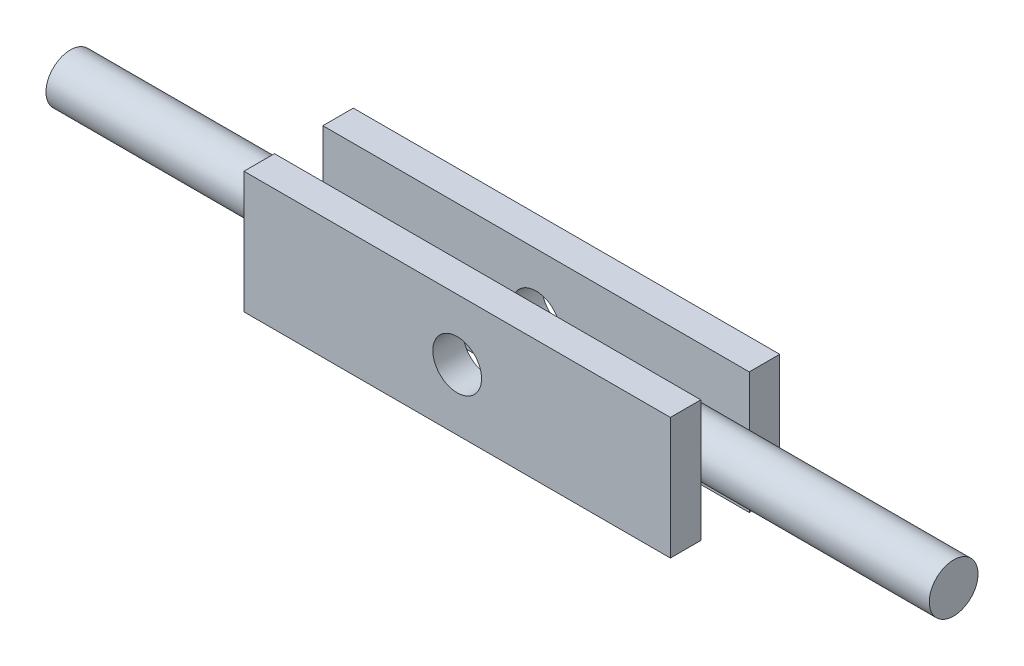
ISO-10303-21;
HEADER;
FILE_DESCRIPTION(('STEP AP214'),'2;1');
FILE_NAME('part.step','',(''),(''),'','','');
FILE_SCHEMA(('AUTOMOTIVE_DESIGN { 1 0 10303 214 1 1 1 1 }'));
ENDSEC;
DATA;
#1=APPLICATION_CONTEXT('core data for automotive mechanical design processes');
#2=APPLICATION_PROTOCOL_DEFINITION('international standard','automotive_design',2000,#1);
#3=PRODUCT_CONTEXT('',#1,'mechanical');
#4=PRODUCT('Part','Part','',(#3));
#5=PRODUCT_RELATED_PRODUCT_CATEGORY('part','',(#4));
#6=PRODUCT_DEFINITION_FORMATION('','',#4);
#7=PRODUCT_DEFINITION_CONTEXT('part definition',#1,'design');
#8=PRODUCT_DEFINITION('design','',#6,#7);
#9=PRODUCT_DEFINITION_SHAPE('','',#8);
#10=(LENGTH_UNIT() NAMED_UNIT(*) SI_UNIT(.MILLI.,.METRE.));
#11=(NAMED_UNIT(*) PLANE_ANGLE_UNIT() SI_UNIT($,.RADIAN.));
#12=(NAMED_UNIT(*) SI_UNIT($,.STERADIAN.) SOLID_ANGLE_UNIT());
#13=UNCERTAINTY_MEASURE_WITH_UNIT(LENGTH_MEASURE(1.E-05),#10,'distance_accuracy_value','');
#14=(GEOMETRIC_REPRESENTATION_CONTEXT(3) GLOBAL_UNCERTAINTY_ASSIGNED_CONTEXT((#13)) GLOBAL_UNIT_ASSIGNED_CONTEXT((#10,
#11,#12)) REPRESENTATION_CONTEXT('',''));
#15=CARTESIAN_POINT('',(0.,0.,0.));
#16=DIRECTION('',(0.,0.,1.));
#17=DIRECTION('',(1.,0.,0.));
#18=AXIS2_PLACEMENT_3D('',#15,#16,#17);
#19=CARTESIAN_POINT('',(-50.,0.,-8.));
#20=DIRECTION('',(-1.,0.,0.));
#21=DIRECTION('',(0.,0.,1.));
#22=AXIS2_PLACEMENT_3D('',#19,#20,#21);
#23=CYLINDRICAL_SURFACE('',#22,8.);
#24=CARTESIAN_POINT('',(-50.,0.,-8.));
#25=DIRECTION('',(-1.,0.,0.));
#26=DIRECTION('',(0.,0.,1.));
#27=AXIS2_PLACEMENT_3D('',#24,#25,#26);
#28=CIRCLE('',#27,8.);
#29=CARTESIAN_POINT('',(-50.,0.,0.));
#30=VERTEX_POINT('',#29);
#31=EDGE_CURVE('E11',#30,#30,#28,.T.);
#32=ORIENTED_EDGE('',*,*,#31,.T.);
#33=EDGE_LOOP('',(#32));
#34=FACE_BOUND('',#33,.T.);
#35=CARTESIAN_POINT('',(-145.,0.,-8.));
#36=DIRECTION('',(-1.,0.,0.));
#37=DIRECTION('',(0.,0.,1.));
#38=AXIS2_PLACEMENT_3D('',#35,#36,#37);
#39=CIRCLE('',#38,8.);
#40=CARTESIAN_POINT('',(-145.,0.,0.));
#41=VERTEX_POINT('',#40);
#42=EDGE_CURVE('E50',#41,#41,#39,.T.);
#43=ORIENTED_EDGE('',*,*,#42,.F.);
#44=EDGE_LOOP('',(#43));
#45=FACE_BOUND('',#44,.T.);
#46=ADVANCED_FACE('F44',(#34,#45),#23,.T.);
#47=CARTESIAN_POINT('',(-50.,0.,-8.));
#48=DIRECTION('',(-1.,0.,0.));
#49=DIRECTION('',(0.,0.,1.));
#50=AXIS2_PLACEMENT_3D('',#47,#48,#49);
#51=PLANE('',#50);
#52=ORIENTED_EDGE('',*,*,#31,.F.);
#53=EDGE_LOOP('',(#52));
#54=FACE_BOUND('',#53,.T.);
#55=ADVANCED_FACE('F59',(#54),#51,.F.);
#56=CARTESIAN_POINT('',(-145.,0.,-8.));
#57=DIRECTION('',(-1.,0.,0.));
#58=DIRECTION('',(0.,0.,1.));
#59=AXIS2_PLACEMENT_3D('',#56,#57,#58);
#60=PLANE('',#59);
#61=ORIENTED_EDGE('',*,*,#42,.T.);
#62=EDGE_LOOP('',(#61));
#63=FACE_BOUND('',#62,.T.);
#64=ADVANCED_FACE('F56',(#63),#60,.T.);
#65=CLOSED_SHELL('',(#46,#55,#64));
#66=MANIFOLD_SOLID_BREP('B2',#65);
#67=CARTESIAN_POINT('',(50.,0.,-8.));
#68=DIRECTION('',(1.,0.,0.));
#69=DIRECTION('',(0.,0.,-1.));
#70=AXIS2_PLACEMENT_3D('',#67,#68,#69);
#71=CYLINDRICAL_SURFACE('',#70,8.);
#72=DIRECTION('',(1.,0.,0.));
#73=VECTOR('',#72,1.);
#74=CARTESIAN_POINT('',(50.,-1.26095202129188,-15.9));
#75=LINE('',#74,#73);
#76=CARTESIAN_POINT('',(70.,-1.26095202129188,-15.9));
#77=VERTEX_POINT('',#76);
#78=CARTESIAN_POINT('',(50.,-1.26095202129188,-15.9));
#79=VERTEX_POINT('',#78);
#80=EDGE_CURVE('E108',#77,#79,#75,.F.);
#81=ORIENTED_EDGE('',*,*,#80,.F.);
#82=CARTESIAN_POINT('',(70.,0.,-8.));
#83=DIRECTION('',(-1.,0.,0.));
#84=DIRECTION('',(0.,0.,1.));
#85=AXIS2_PLACEMENT_3D('',#82,#83,#84);
#86=CIRCLE('',#85,8.);
#87=CARTESIAN_POINT('',(70.,1.26095202129188,-15.9));
#88=VERTEX_POINT('',#87);
#89=EDGE_CURVE('E42',#77,#88,#86,.F.);
#90=ORIENTED_EDGE('',*,*,#89,.T.);
#91=DIRECTION('',(1.,0.,0.));
#92=VECTOR('',#91,1.);
#93=CARTESIAN_POINT('',(50.,1.26095202129188,-15.9));
#94=LINE('',#93,#92);
#95=CARTESIAN_POINT('',(50.,1.26095202129188,-15.9));
#96=VERTEX_POINT('',#95);
#97=EDGE_CURVE('E168',#96,#88,#94,.T.);
#98=ORIENTED_EDGE('',*,*,#97,.F.);
#99=CARTESIAN_POINT('',(50.,0.,-8.));
#100=DIRECTION('',(1.,0.,0.));
#101=DIRECTION('',(0.,0.,-1.));
#102=AXIS2_PLACEMENT_3D('',#99,#100,#101);
#103=CIRCLE('',#102,8.);
#104=EDGE_CURVE('E179',#96,#79,#103,.T.);
#105=ORIENTED_EDGE('',*,*,#104,.T.);
#106=EDGE_LOOP('',(#81,#90,#98,#105));
#107=FACE_BOUND('',#106,.T.);
#108=CARTESIAN_POINT('',(145.,0.,-8.));
#109=DIRECTION('',(1.,0.,0.));
#110=DIRECTION('',(0.,0.,-1.));
#111=AXIS2_PLACEMENT_3D('',#108,#109,#110);
#112=CIRCLE('',#111,8.);
#113=CARTESIAN_POINT('',(145.,0.,-16.));
#114=VERTEX_POINT('',#113);
#115=EDGE_CURVE('E176',#114,#114,#112,.T.);
#116=ORIENTED_EDGE('',*,*,#115,.F.);
#117=EDGE_LOOP('',(#116));
#118=FACE_BOUND('',#117,.T.);
#119=ADVANCED_FACE('F94',(#107,#118),#71,.T.);
#120=CARTESIAN_POINT('',(50.,0.,-8.));
#121=DIRECTION('',(1.,0.,0.));
#122=DIRECTION('',(0.,0.,-1.));
#123=AXIS2_PLACEMENT_3D('',#120,#121,#122);
#124=PLANE('',#123);
#125=ORIENTED_EDGE('',*,*,#104,.F.);
#126=DIRECTION('',(0.,-1.,0.));
#127=VECTOR('',#126,1.);
#128=CARTESIAN_POINT('',(50.,0.,-15.9));
#129=LINE('',#128,#127);
#130=EDGE_CURVE('E101',#96,#79,#129,.T.);
#131=ORIENTED_EDGE('',*,*,#130,.T.);
#132=EDGE_LOOP('',(#125,#131));
#133=FACE_BOUND('',#132,.T.);
#134=ADVANCED_FACE('F183',(#133),#124,.F.);
#135=CARTESIAN_POINT('',(145.,0.,-8.));
#136=DIRECTION('',(1.,0.,0.));
#137=DIRECTION('',(0.,0.,-1.));
#138=AXIS2_PLACEMENT_3D('',#135,#136,#137);
#139=PLANE('',#138);
#140=ORIENTED_EDGE('',*,*,#115,.T.);
#141=EDGE_LOOP('',(#140));
#142=FACE_BOUND('',#141,.T.);
#143=ADVANCED_FACE('F227',(#142),#139,.T.);
#144=CARTESIAN_POINT('',(-70.,-20.,-15.9));
#145=DIRECTION('',(1.,0.,0.));
#146=DIRECTION('',(0.,0.,-1.));
#147=AXIS2_PLACEMENT_3D('',#144,#145,#146);
#148=PLANE('',#147);
#149=DIRECTION('',(0.,-1.,0.));
#150=VECTOR('',#149,1.);
#151=CARTESIAN_POINT('',(-70.,-20.,-25.9));
#152=LINE('',#151,#150);
#153=CARTESIAN_POINT('',(-70.,20.,-25.9));
#154=VERTEX_POINT('',#153);
#155=CARTESIAN_POINT('',(-70.,-20.,-25.9));
#156=VERTEX_POINT('',#155);
#157=EDGE_CURVE('E167',#154,#156,#152,.T.);
#158=ORIENTED_EDGE('',*,*,#157,.T.);
#159=DIRECTION('',(0.,0.,-1.));
#160=VECTOR('',#159,1.);
#161=CARTESIAN_POINT('',(-70.,-20.,-15.9));
#162=LINE('',#161,#160);
#163=CARTESIAN_POINT('',(-70.,-20.,-15.9));
#164=VERTEX_POINT('',#163);
#165=EDGE_CURVE('E148',#164,#156,#162,.T.);
#166=ORIENTED_EDGE('',*,*,#165,.F.);
#167=DIRECTION('',(0.,-1.,0.));
#168=VECTOR('',#167,1.);
#169=CARTESIAN_POINT('',(-70.,-20.,-15.9));
#170=LINE('',#169,#168);
#171=CARTESIAN_POINT('',(-70.,20.,-15.9));
#172=VERTEX_POINT('',#171);
#173=EDGE_CURVE('E154',#172,#164,#170,.T.);
#174=ORIENTED_EDGE('',*,*,#173,.F.);
#175=DIRECTION('',(0.,0.,-1.));
#176=VECTOR('',#175,1.);
#177=CARTESIAN_POINT('',(-70.,20.,-15.9));
#178=LINE('',#177,#176);
#179=EDGE_CURVE('E195',#172,#154,#178,.T.);
#180=ORIENTED_EDGE('',*,*,#179,.T.);
#181=EDGE_LOOP('',(#158,#166,#174,#180));
#182=FACE_BOUND('',#181,.T.);
#183=ADVANCED_FACE('F165',(#182),#148,.F.);
#184=CARTESIAN_POINT('',(70.,-20.,-15.9));
#185=DIRECTION('',(0.,1.,0.));
#186=DIRECTION('',(-1.,0.,0.));
#187=AXIS2_PLACEMENT_3D('',#184,#185,#186);
#188=PLANE('',#187);
#189=DIRECTION('',(1.,0.,0.));
#190=VECTOR('',#189,1.);
#191=CARTESIAN_POINT('',(70.,-20.,-25.9));
#192=LINE('',#191,#190);
#193=CARTESIAN_POINT('',(70.,-20.,-25.9));
#194=VERTEX_POINT('',#193);
#195=EDGE_CURVE('E197',#156,#194,#192,.T.);
#196=ORIENTED_EDGE('',*,*,#195,.T.);
#197=DIRECTION('',(0.,0.,-1.));
#198=VECTOR('',#197,1.);
#199=CARTESIAN_POINT('',(70.,-20.,-15.9));
#200=LINE('',#199,#198);
#201=CARTESIAN_POINT('',(70.,-20.,-15.9));
#202=VERTEX_POINT('',#201);
#203=EDGE_CURVE('E151',#202,#194,#200,.T.);
#204=ORIENTED_EDGE('',*,*,#203,.F.);
#205=DIRECTION('',(1.,0.,0.));
#206=VECTOR('',#205,1.);
#207=CARTESIAN_POINT('',(70.,-20.,-15.9));
#208=LINE('',#207,#206);
#209=EDGE_CURVE('E144',#164,#202,#208,.T.);
#210=ORIENTED_EDGE('',*,*,#209,.F.);
#211=ORIENTED_EDGE('',*,*,#165,.T.);
#212=EDGE_LOOP('',(#196,#204,#210,#211));
#213=FACE_BOUND('',#212,.T.);
#214=ADVANCED_FACE('F146',(#213),#188,.F.);
#215=CARTESIAN_POINT('',(70.,-20.,-15.9));
#216=DIRECTION('',(-1.,0.,0.));
#217=DIRECTION('',(0.,0.,1.));
#218=AXIS2_PLACEMENT_3D('',#215,#216,#217);
#219=PLANE('',#218);
#220=ORIENTED_EDGE('',*,*,#89,.F.);
#221=DIRECTION('',(0.,1.,0.));
#222=VECTOR('',#221,1.);
#223=CARTESIAN_POINT('',(70.,-20.,-15.9));
#224=LINE('',#223,#222);
#225=EDGE_CURVE('E191',#202,#77,#224,.T.);
#226=ORIENTED_EDGE('',*,*,#225,.F.);
#227=ORIENTED_EDGE('',*,*,#203,.T.);
#228=DIRECTION('',(0.,1.,0.));
#229=VECTOR('',#228,1.);
#230=CARTESIAN_POINT('',(70.,-20.,-25.9));
#231=LINE('',#230,#229);
#232=CARTESIAN_POINT('',(70.,20.,-25.9));
#233=VERTEX_POINT('',#232);
#234=EDGE_CURVE('E200',#194,#233,#231,.T.);
#235=ORIENTED_EDGE('',*,*,#234,.T.);
#236=DIRECTION('',(0.,0.,-1.));
#237=VECTOR('',#236,1.);
#238=CARTESIAN_POINT('',(70.,20.,-15.9));
#239=LINE('',#238,#237);
#240=CARTESIAN_POINT('',(70.,20.,-15.9));
#241=VERTEX_POINT('',#240);
#242=EDGE_CURVE('E171',#241,#233,#239,.T.);
#243=ORIENTED_EDGE('',*,*,#242,.F.);
#244=EDGE_CURVE('E153',#88,#241,#224,.T.);
#245=ORIENTED_EDGE('',*,*,#244,.F.);
#246=EDGE_LOOP('',(#220,#226,#227,#235,#243,#245));
#247=FACE_BOUND('',#246,.T.);
#248=ADVANCED_FACE('F189',(#247),#219,.F.);
#249=CARTESIAN_POINT('',(70.,20.,-15.9));
#250=DIRECTION('',(0.,-1.,0.));
#251=DIRECTION('',(1.,0.,0.));
#252=AXIS2_PLACEMENT_3D('',#249,#250,#251);
#253=PLANE('',#252);
#254=DIRECTION('',(-1.,0.,0.));
#255=VECTOR('',#254,1.);
#256=CARTESIAN_POINT('',(70.,20.,-25.9));
#257=LINE('',#256,#255);
#258=EDGE_CURVE('E163',#233,#154,#257,.T.);
#259=ORIENTED_EDGE('',*,*,#258,.T.);
#260=ORIENTED_EDGE('',*,*,#179,.F.);
#261=DIRECTION('',(-1.,0.,0.));
#262=VECTOR('',#261,1.);
#263=CARTESIAN_POINT('',(70.,20.,-15.9));
#264=LINE('',#263,#262);
#265=EDGE_CURVE('E159',#241,#172,#264,.T.);
#266=ORIENTED_EDGE('',*,*,#265,.F.);
#267=ORIENTED_EDGE('',*,*,#242,.T.);
#268=EDGE_LOOP('',(#259,#260,#266,#267));
#269=FACE_BOUND('',#268,.T.);
#270=ADVANCED_FACE('F205',(#269),#253,.F.);
#271=CARTESIAN_POINT('',(0.,0.,-15.9));
#272=DIRECTION('',(0.,0.,1.));
#273=DIRECTION('',(1.,0.,0.));
#274=AXIS2_PLACEMENT_3D('',#271,#272,#273);
#275=PLANE('',#274);
#276=CARTESIAN_POINT('',(0.,0.,-15.9));
#277=DIRECTION('',(0.,0.,1.));
#278=DIRECTION('',(1.,0.,0.));
#279=AXIS2_PLACEMENT_3D('',#276,#277,#278);
#280=CIRCLE('',#279,8.);
#281=CARTESIAN_POINT('',(7.99999999999998,0.,-15.9));
#282=VERTEX_POINT('',#281);
#283=EDGE_CURVE('E198',#282,#282,#280,.T.);
#284=ORIENTED_EDGE('',*,*,#283,.F.);
#285=EDGE_LOOP('',(#284));
#286=FACE_BOUND('',#285,.T.);
#287=ORIENTED_EDGE('',*,*,#225,.T.);
#288=ORIENTED_EDGE('',*,*,#80,.T.);
#289=ORIENTED_EDGE('',*,*,#130,.F.);
#290=ORIENTED_EDGE('',*,*,#97,.T.);
#291=ORIENTED_EDGE('',*,*,#244,.T.);
#292=ORIENTED_EDGE('',*,*,#265,.T.);
#293=ORIENTED_EDGE('',*,*,#173,.T.);
#294=ORIENTED_EDGE('',*,*,#209,.T.);
#295=EDGE_LOOP('',(#287,#288,#289,#290,#291,#292,#293,#294));
#296=FACE_BOUND('',#295,.T.);
#297=ADVANCED_FACE('F157',(#286,#296),#275,.T.);
#298=CARTESIAN_POINT('',(0.,0.,-25.9));
#299=DIRECTION('',(0.,0.,1.));
#300=DIRECTION('',(1.,0.,0.));
#301=AXIS2_PLACEMENT_3D('',#298,#299,#300);
#302=PLANE('',#301);
#303=CARTESIAN_POINT('',(0.,0.,-25.9));
#304=DIRECTION('',(0.,0.,-1.));
#305=DIRECTION('',(-1.,0.,0.));
#306=AXIS2_PLACEMENT_3D('',#303,#304,#305);
#307=CIRCLE('',#306,8.);
#308=CARTESIAN_POINT('',(-8.00000000000001,0.,-25.9));
#309=VERTEX_POINT('',#308);
#310=EDGE_CURVE('E296',#309,#309,#307,.T.);
#311=ORIENTED_EDGE('',*,*,#310,.F.);
#312=EDGE_LOOP('',(#311));
#313=FACE_BOUND('',#312,.T.);
#314=ORIENTED_EDGE('',*,*,#157,.F.);
#315=ORIENTED_EDGE('',*,*,#258,.F.);
#316=ORIENTED_EDGE('',*,*,#234,.F.);
#317=ORIENTED_EDGE('',*,*,#195,.F.);
#318=EDGE_LOOP('',(#314,#315,#316,#317));
#319=FACE_BOUND('',#318,.T.);
#320=ADVANCED_FACE('F208',(#313,#319),#302,.F.);
#321=CARTESIAN_POINT('',(0.,0.,74.1));
#322=DIRECTION('',(0.,0.,-1.));
#323=DIRECTION('',(-1.,0.,0.));
#324=AXIS2_PLACEMENT_3D('',#321,#322,#323);
#325=CYLINDRICAL_SURFACE('',#324,8.);
#326=ORIENTED_EDGE('',*,*,#283,.T.);
#327=EDGE_LOOP('',(#326));
#328=FACE_BOUND('',#327,.T.);
#329=ORIENTED_EDGE('',*,*,#310,.T.);
#330=EDGE_LOOP('',(#329));
#331=FACE_BOUND('',#330,.T.);
#332=ADVANCED_FACE('F210',(#328,#331),#325,.F.);
#333=CLOSED_SHELL('',(#119,#134,#143,#183,#214,#248,#270,#297,#320,#332));
#334=MANIFOLD_SOLID_BREP('B6',#333);
#335=CARTESIAN_POINT('',(-70.,-20.,10.));
#336=DIRECTION('',(1.,0.,0.));
#337=DIRECTION('',(0.,0.,-1.));
#338=AXIS2_PLACEMENT_3D('',#335,#336,#337);
#339=PLANE('',#338);
#340=DIRECTION('',(0.,-1.,0.));
#341=VECTOR('',#340,1.);
#342=CARTESIAN_POINT('',(-70.,-20.,0.));
#343=LINE('',#342,#341);
#344=CARTESIAN_POINT('',(-70.,20.,0.));
#345=VERTEX_POINT('',#344);
#346=CARTESIAN_POINT('',(-70.,-20.,0.));
#347=VERTEX_POINT('',#346);
#348=EDGE_CURVE('E368',#345,#347,#343,.T.);
#349=ORIENTED_EDGE('',*,*,#348,.T.);
#350=DIRECTION('',(0.,0.,-1.));
#351=VECTOR('',#350,1.);
#352=CARTESIAN_POINT('',(-70.,-20.,10.));
#353=LINE('',#352,#351);
#354=CARTESIAN_POINT('',(-70.,-20.,10.));
#355=VERTEX_POINT('',#354);
#356=EDGE_CURVE('E92',#355,#347,#353,.T.);
#357=ORIENTED_EDGE('',*,*,#356,.F.);
#358=DIRECTION('',(0.,-1.,0.));
#359=VECTOR('',#358,1.);
#360=CARTESIAN_POINT('',(-70.,-20.,10.));
#361=LINE('',#360,#359);
#362=CARTESIAN_POINT('',(-70.,20.,10.));
#363=VERTEX_POINT('',#362);
#364=EDGE_CURVE('E356',#363,#355,#361,.T.);
#365=ORIENTED_EDGE('',*,*,#364,.F.);
#366=DIRECTION('',(0.,0.,-1.));
#367=VECTOR('',#366,1.);
#368=CARTESIAN_POINT('',(-70.,20.,10.));
#369=LINE('',#368,#367);
#370=EDGE_CURVE('E364',#363,#345,#369,.T.);
#371=ORIENTED_EDGE('',*,*,#370,.T.);
#372=EDGE_LOOP('',(#349,#357,#365,#371));
#373=FACE_BOUND('',#372,.T.);
#374=ADVANCED_FACE('F305',(#373),#339,.F.);
#375=CARTESIAN_POINT('',(70.,-20.,10.));
#376=DIRECTION('',(0.,1.,0.));
#377=DIRECTION('',(-1.,0.,0.));
#378=AXIS2_PLACEMENT_3D('',#375,#376,#377);
#379=PLANE('',#378);
#380=DIRECTION('',(1.,0.,0.));
#381=VECTOR('',#380,1.);
#382=CARTESIAN_POINT('',(70.,-20.,0.));
#383=LINE('',#382,#381);
#384=CARTESIAN_POINT('',(70.,-20.,0.));
#385=VERTEX_POINT('',#384);
#386=EDGE_CURVE('E360',#347,#385,#383,.T.);
#387=ORIENTED_EDGE('',*,*,#386,.T.);
#388=DIRECTION('',(0.,0.,-1.));
#389=VECTOR('',#388,1.);
#390=CARTESIAN_POINT('',(70.,-20.,10.));
#391=LINE('',#390,#389);
#392=CARTESIAN_POINT('',(70.,-20.,10.));
#393=VERTEX_POINT('',#392);
#394=EDGE_CURVE('E313',#393,#385,#391,.T.);
#395=ORIENTED_EDGE('',*,*,#394,.F.);
#396=DIRECTION('',(1.,0.,0.));
#397=VECTOR('',#396,1.);
#398=CARTESIAN_POINT('',(70.,-20.,10.));
#399=LINE('',#398,#397);
#400=EDGE_CURVE('E351',#355,#393,#399,.T.);
#401=ORIENTED_EDGE('',*,*,#400,.F.);
#402=ORIENTED_EDGE('',*,*,#356,.T.);
#403=EDGE_LOOP('',(#387,#395,#401,#402));
#404=FACE_BOUND('',#403,.T.);
#405=ADVANCED_FACE('F359',(#404),#379,.F.);
#406=CARTESIAN_POINT('',(70.,-20.,10.));
#407=DIRECTION('',(-1.,0.,0.));
#408=DIRECTION('',(0.,0.,1.));
#409=AXIS2_PLACEMENT_3D('',#406,#407,#408);
#410=PLANE('',#409);
#411=DIRECTION('',(0.,1.,0.));
#412=VECTOR('',#411,1.);
#413=CARTESIAN_POINT('',(70.,-20.,0.));
#414=LINE('',#413,#412);
#415=CARTESIAN_POINT('',(70.,20.,0.));
#416=VERTEX_POINT('',#415);
#417=EDGE_CURVE('E338',#385,#416,#414,.T.);
#418=ORIENTED_EDGE('',*,*,#417,.T.);
#419=DIRECTION('',(0.,0.,-1.));
#420=VECTOR('',#419,1.);
#421=CARTESIAN_POINT('',(70.,20.,10.));
#422=LINE('',#421,#420);
#423=CARTESIAN_POINT('',(70.,20.,10.));
#424=VERTEX_POINT('',#423);
#425=EDGE_CURVE('E361',#424,#416,#422,.T.);
#426=ORIENTED_EDGE('',*,*,#425,.F.);
#427=DIRECTION('',(0.,1.,0.));
#428=VECTOR('',#427,1.);
#429=CARTESIAN_POINT('',(70.,-20.,10.));
#430=LINE('',#429,#428);
#431=EDGE_CURVE('E354',#393,#424,#430,.T.);
#432=ORIENTED_EDGE('',*,*,#431,.F.);
#433=ORIENTED_EDGE('',*,*,#394,.T.);
#434=EDGE_LOOP('',(#418,#426,#432,#433));
#435=FACE_BOUND('',#434,.T.);
#436=ADVANCED_FACE('F362',(#435),#410,.F.);
#437=CARTESIAN_POINT('',(70.,20.,10.));
#438=DIRECTION('',(0.,-1.,0.));
#439=DIRECTION('',(1.,0.,0.));
#440=AXIS2_PLACEMENT_3D('',#437,#438,#439);
#441=PLANE('',#440);
#442=DIRECTION('',(-1.,0.,0.));
#443=VECTOR('',#442,1.);
#444=CARTESIAN_POINT('',(70.,20.,0.));
#445=LINE('',#444,#443);
#446=EDGE_CURVE('E344',#416,#345,#445,.T.);
#447=ORIENTED_EDGE('',*,*,#446,.T.);
#448=ORIENTED_EDGE('',*,*,#370,.F.);
#449=DIRECTION('',(-1.,0.,0.));
#450=VECTOR('',#449,1.);
#451=CARTESIAN_POINT('',(70.,20.,10.));
#452=LINE('',#451,#450);
#453=EDGE_CURVE('E321',#424,#363,#452,.T.);
#454=ORIENTED_EDGE('',*,*,#453,.F.);
#455=ORIENTED_EDGE('',*,*,#425,.T.);
#456=EDGE_LOOP('',(#447,#448,#454,#455));
#457=FACE_BOUND('',#456,.T.);
#458=ADVANCED_FACE('F376',(#457),#441,.F.);
#459=CARTESIAN_POINT('',(0.,0.,10.));
#460=DIRECTION('',(0.,0.,1.));
#461=DIRECTION('',(1.,0.,0.));
#462=AXIS2_PLACEMENT_3D('',#459,#460,#461);
#463=PLANE('',#462);
#464=CARTESIAN_POINT('',(0.,0.,10.));
#465=DIRECTION('',(0.,0.,1.));
#466=DIRECTION('',(1.,0.,0.));
#467=AXIS2_PLACEMENT_3D('',#464,#465,#466);
#468=CIRCLE('',#467,8.);
#469=CARTESIAN_POINT('',(7.99999999999998,0.,10.));
#470=VERTEX_POINT('',#469);
#471=EDGE_CURVE('E382',#470,#470,#468,.T.);
#472=ORIENTED_EDGE('',*,*,#471,.F.);
#473=EDGE_LOOP('',(#472));
#474=FACE_BOUND('',#473,.T.);
#475=ORIENTED_EDGE('',*,*,#364,.T.);
#476=ORIENTED_EDGE('',*,*,#400,.T.);
#477=ORIENTED_EDGE('',*,*,#431,.T.);
#478=ORIENTED_EDGE('',*,*,#453,.T.);
#479=EDGE_LOOP('',(#475,#476,#477,#478));
#480=FACE_BOUND('',#479,.T.);
#481=ADVANCED_FACE('F352',(#474,#480),#463,.T.);
#482=CARTESIAN_POINT('',(0.,0.,0.));
#483=DIRECTION('',(0.,0.,1.));
#484=DIRECTION('',(1.,0.,0.));
#485=AXIS2_PLACEMENT_3D('',#482,#483,#484);
#486=PLANE('',#485);
#487=CARTESIAN_POINT('',(0.,0.,0.));
#488=DIRECTION('',(0.,0.,1.));
#489=DIRECTION('',(1.,0.,0.));
#490=AXIS2_PLACEMENT_3D('',#487,#488,#489);
#491=CIRCLE('',#490,8.);
#492=CARTESIAN_POINT('',(7.99999999999998,0.,0.));
#493=VERTEX_POINT('',#492);
#494=EDGE_CURVE('E371',#493,#493,#491,.T.);
#495=ORIENTED_EDGE('',*,*,#494,.T.);
#496=EDGE_LOOP('',(#495));
#497=FACE_BOUND('',#496,.T.);
#498=ORIENTED_EDGE('',*,*,#348,.F.);
#499=ORIENTED_EDGE('',*,*,#446,.F.);
#500=ORIENTED_EDGE('',*,*,#417,.F.);
#501=ORIENTED_EDGE('',*,*,#386,.F.);
#502=EDGE_LOOP('',(#498,#499,#500,#501));
#503=FACE_BOUND('',#502,.T.);
#504=ADVANCED_FACE('F379',(#497,#503),#486,.F.);
#505=CARTESIAN_POINT('',(0.,0.,0.));
#506=DIRECTION('',(0.,0.,1.));
#507=DIRECTION('',(1.,0.,0.));
#508=AXIS2_PLACEMENT_3D('',#505,#506,#507);
#509=CYLINDRICAL_SURFACE('',#508,8.);
#510=ORIENTED_EDGE('',*,*,#494,.F.);
#511=EDGE_LOOP('',(#510));
#512=FACE_BOUND('',#511,.T.);
#513=ORIENTED_EDGE('',*,*,#471,.T.);
#514=EDGE_LOOP('',(#513));
#515=FACE_BOUND('',#514,.T.);
#516=ADVANCED_FACE('F389',(#512,#515),#509,.F.);
#517=CLOSED_SHELL('',(#374,#405,#436,#458,#481,#504,#516));
#518=MANIFOLD_SOLID_BREP('B36',#517);
#519=ADVANCED_BREP_SHAPE_REPRESENTATION('',(#18,#66,#334,#518),#14);
#520=SHAPE_DEFINITION_REPRESENTATION(#9,#519);
ENDSEC;
END-ISO-10303-21;
